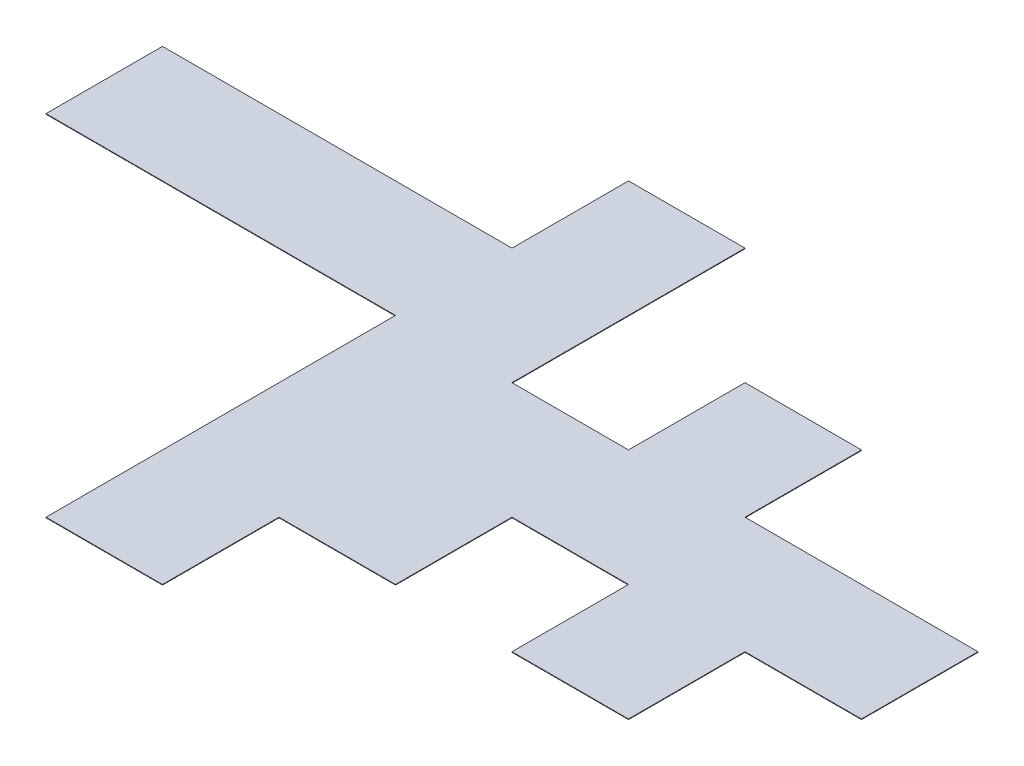
ISO-10303-21;
HEADER;
FILE_DESCRIPTION(('STEP AP214'),'2;1');
FILE_NAME('part.step','',(''),(''),'','','');
FILE_SCHEMA(('AUTOMOTIVE_DESIGN { 1 0 10303 214 1 1 1 1 }'));
ENDSEC;
DATA;
#1=APPLICATION_CONTEXT('core data for automotive mechanical design processes');
#2=APPLICATION_PROTOCOL_DEFINITION('international standard','automotive_design',2000,#1);
#3=PRODUCT_CONTEXT('',#1,'mechanical');
#4=PRODUCT('Part','Part','',(#3));
#5=PRODUCT_RELATED_PRODUCT_CATEGORY('part','',(#4));
#6=PRODUCT_DEFINITION_FORMATION('','',#4);
#7=PRODUCT_DEFINITION_CONTEXT('part definition',#1,'design');
#8=PRODUCT_DEFINITION('design','',#6,#7);
#9=PRODUCT_DEFINITION_SHAPE('','',#8);
#10=(LENGTH_UNIT() NAMED_UNIT(*) SI_UNIT(.MILLI.,.METRE.));
#11=(NAMED_UNIT(*) PLANE_ANGLE_UNIT() SI_UNIT($,.RADIAN.));
#12=(NAMED_UNIT(*) SI_UNIT($,.STERADIAN.) SOLID_ANGLE_UNIT());
#13=UNCERTAINTY_MEASURE_WITH_UNIT(LENGTH_MEASURE(1.E-05),#10,'distance_accuracy_value','');
#14=(GEOMETRIC_REPRESENTATION_CONTEXT(3) GLOBAL_UNCERTAINTY_ASSIGNED_CONTEXT((#13)) GLOBAL_UNIT_ASSIGNED_CONTEXT((#10,
#11,#12)) REPRESENTATION_CONTEXT('',''));
#15=CARTESIAN_POINT('',(0.,0.,0.));
#16=DIRECTION('',(0.,0.,1.));
#17=DIRECTION('',(1.,0.,0.));
#18=AXIS2_PLACEMENT_3D('',#15,#16,#17);
#19=CARTESIAN_POINT('',(5.37318429210575,2.601,3.02932140298636E-13));
#20=DIRECTION('',(1.,0.,0.));
#21=DIRECTION('',(0.,0.,-1.));
#22=AXIS2_PLACEMENT_3D('',#19,#20,#21);
#23=PLANE('',#22);
#24=DIRECTION('',(0.,0.,1.));
#25=VECTOR('',#24,1.);
#26=CARTESIAN_POINT('',(5.37318429210575,2.6,3.02932140298636E-13));
#27=LINE('',#26,#25);
#28=CARTESIAN_POINT('',(5.37318429210567,2.6,1.11907068929163));
#29=VERTEX_POINT('',#28);
#30=CARTESIAN_POINT('',(5.37318429210567,2.6,1.31907068929163));
#31=VERTEX_POINT('',#30);
#32=EDGE_CURVE('E11',#29,#31,#27,.T.);
#33=ORIENTED_EDGE('',*,*,#32,.F.);
#34=DIRECTION('',(0.,-1.,0.));
#35=VECTOR('',#34,1.);
#36=CARTESIAN_POINT('',(5.37318429210567,2.601,1.11907068929163));
#37=LINE('',#36,#35);
#38=CARTESIAN_POINT('',(5.37318429210567,2.601,1.11907068929163));
#39=VERTEX_POINT('',#38);
#40=EDGE_CURVE('E24',#39,#29,#37,.T.);
#41=ORIENTED_EDGE('',*,*,#40,.F.);
#42=DIRECTION('',(0.,0.,1.));
#43=VECTOR('',#42,1.);
#44=CARTESIAN_POINT('',(5.37318429210575,2.601,3.02932140298636E-13));
#45=LINE('',#44,#43);
#46=CARTESIAN_POINT('',(5.37318429210567,2.601,1.31907068929163));
#47=VERTEX_POINT('',#46);
#48=EDGE_CURVE('E348',#39,#47,#45,.T.);
#49=ORIENTED_EDGE('',*,*,#48,.T.);
#50=DIRECTION('',(0.,-1.,0.));
#51=VECTOR('',#50,1.);
#52=CARTESIAN_POINT('',(5.37318429210567,2.601,1.31907068929163));
#53=LINE('',#52,#51);
#54=EDGE_CURVE('E186',#47,#31,#53,.T.);
#55=ORIENTED_EDGE('',*,*,#54,.T.);
#56=EDGE_LOOP('',(#33,#41,#49,#55));
#57=FACE_BOUND('',#56,.T.);
#58=ADVANCED_FACE('F17',(#57),#23,.T.);
#59=CARTESIAN_POINT('',(0.,2.601,1.11907068929163));
#60=DIRECTION('',(0.,0.,-1.));
#61=DIRECTION('',(-1.,0.,0.));
#62=AXIS2_PLACEMENT_3D('',#59,#60,#61);
#63=PLANE('',#62);
#64=DIRECTION('',(1.,0.,0.));
#65=VECTOR('',#64,1.);
#66=CARTESIAN_POINT('',(0.,2.6,1.11907068929163));
#67=LINE('',#66,#65);
#68=CARTESIAN_POINT('',(5.17318429210602,2.6,1.11907068929163));
#69=VERTEX_POINT('',#68);
#70=EDGE_CURVE('E345',#69,#29,#67,.T.);
#71=ORIENTED_EDGE('',*,*,#70,.F.);
#72=DIRECTION('',(0.,-1.,0.));
#73=VECTOR('',#72,1.);
#74=CARTESIAN_POINT('',(5.17318429210602,2.601,1.11907068929163));
#75=LINE('',#74,#73);
#76=CARTESIAN_POINT('',(5.17318429210602,2.601,1.11907068929163));
#77=VERTEX_POINT('',#76);
#78=EDGE_CURVE('E342',#77,#69,#75,.T.);
#79=ORIENTED_EDGE('',*,*,#78,.F.);
#80=DIRECTION('',(1.,0.,0.));
#81=VECTOR('',#80,1.);
#82=CARTESIAN_POINT('',(0.,2.601,1.11907068929163));
#83=LINE('',#82,#81);
#84=EDGE_CURVE('E339',#77,#39,#83,.T.);
#85=ORIENTED_EDGE('',*,*,#84,.T.);
#86=ORIENTED_EDGE('',*,*,#40,.T.);
#87=EDGE_LOOP('',(#71,#79,#85,#86));
#88=FACE_BOUND('',#87,.T.);
#89=ADVANCED_FACE('F350',(#88),#63,.T.);
#90=CARTESIAN_POINT('',(5.17318429210609,2.601,2.91656437704806E-13));
#91=DIRECTION('',(1.,0.,0.));
#92=DIRECTION('',(0.,0.,-1.));
#93=AXIS2_PLACEMENT_3D('',#90,#91,#92);
#94=PLANE('',#93);
#95=DIRECTION('',(0.,0.,1.));
#96=VECTOR('',#95,1.);
#97=CARTESIAN_POINT('',(5.17318429210609,2.6,2.91656437704806E-13));
#98=LINE('',#97,#96);
#99=CARTESIAN_POINT('',(5.17318429210601,2.6,1.31907068929163));
#100=VERTEX_POINT('',#99);
#101=EDGE_CURVE('E337',#69,#100,#98,.T.);
#102=ORIENTED_EDGE('',*,*,#101,.T.);
#103=DIRECTION('',(0.,-1.,0.));
#104=VECTOR('',#103,1.);
#105=CARTESIAN_POINT('',(5.17318429210601,2.601,1.31907068929163));
#106=LINE('',#105,#104);
#107=CARTESIAN_POINT('',(5.17318429210601,2.601,1.31907068929163));
#108=VERTEX_POINT('',#107);
#109=EDGE_CURVE('E334',#108,#100,#106,.T.);
#110=ORIENTED_EDGE('',*,*,#109,.F.);
#111=DIRECTION('',(0.,0.,1.));
#112=VECTOR('',#111,1.);
#113=CARTESIAN_POINT('',(5.17318429210609,2.601,2.91656437704806E-13));
#114=LINE('',#113,#112);
#115=EDGE_CURVE('E331',#77,#108,#114,.T.);
#116=ORIENTED_EDGE('',*,*,#115,.F.);
#117=ORIENTED_EDGE('',*,*,#78,.T.);
#118=EDGE_LOOP('',(#102,#110,#116,#117));
#119=FACE_BOUND('',#118,.T.);
#120=ADVANCED_FACE('F355',(#119),#94,.F.);
#121=CARTESIAN_POINT('',(0.,2.601,1.31907068929163));
#122=DIRECTION('',(0.,0.,-1.));
#123=DIRECTION('',(-1.,0.,0.));
#124=AXIS2_PLACEMENT_3D('',#121,#122,#123);
#125=PLANE('',#124);
#126=DIRECTION('',(1.,0.,0.));
#127=VECTOR('',#126,1.);
#128=CARTESIAN_POINT('',(0.,2.6,1.31907068929163));
#129=LINE('',#128,#127);
#130=CARTESIAN_POINT('',(4.97318429210635,2.6,1.31907068929163));
#131=VERTEX_POINT('',#130);
#132=EDGE_CURVE('E328',#131,#100,#129,.T.);
#133=ORIENTED_EDGE('',*,*,#132,.F.);
#134=DIRECTION('',(0.,-1.,0.));
#135=VECTOR('',#134,1.);
#136=CARTESIAN_POINT('',(4.97318429210635,2.601,1.31907068929163));
#137=LINE('',#136,#135);
#138=CARTESIAN_POINT('',(4.97318429210635,2.601,1.31907068929163));
#139=VERTEX_POINT('',#138);
#140=EDGE_CURVE('E325',#139,#131,#137,.T.);
#141=ORIENTED_EDGE('',*,*,#140,.F.);
#142=DIRECTION('',(1.,0.,0.));
#143=VECTOR('',#142,1.);
#144=CARTESIAN_POINT('',(0.,2.601,1.31907068929163));
#145=LINE('',#144,#143);
#146=EDGE_CURVE('E322',#139,#108,#145,.T.);
#147=ORIENTED_EDGE('',*,*,#146,.T.);
#148=ORIENTED_EDGE('',*,*,#109,.T.);
#149=EDGE_LOOP('',(#133,#141,#147,#148));
#150=FACE_BOUND('',#149,.T.);
#151=ADVANCED_FACE('F358',(#150),#125,.T.);
#152=CARTESIAN_POINT('',(4.97318429210643,2.601,3.01948483965667E-13));
#153=DIRECTION('',(1.,0.,0.));
#154=DIRECTION('',(0.,0.,-1.));
#155=AXIS2_PLACEMENT_3D('',#152,#153,#154);
#156=PLANE('',#155);
#157=DIRECTION('',(0.,0.,1.));
#158=VECTOR('',#157,1.);
#159=CARTESIAN_POINT('',(4.97318429210643,2.6,3.01948483965666E-13));
#160=LINE('',#159,#158);
#161=CARTESIAN_POINT('',(4.97318429210637,2.6,0.919070689291635));
#162=VERTEX_POINT('',#161);
#163=EDGE_CURVE('E319',#162,#131,#160,.T.);
#164=ORIENTED_EDGE('',*,*,#163,.F.);
#165=DIRECTION('',(0.,-1.,0.));
#166=VECTOR('',#165,1.);
#167=CARTESIAN_POINT('',(4.97318429210637,2.601,0.919070689291635));
#168=LINE('',#167,#166);
#169=CARTESIAN_POINT('',(4.97318429210637,2.601,0.919070689291635));
#170=VERTEX_POINT('',#169);
#171=EDGE_CURVE('E316',#170,#162,#168,.T.);
#172=ORIENTED_EDGE('',*,*,#171,.F.);
#173=DIRECTION('',(0.,0.,1.));
#174=VECTOR('',#173,1.);
#175=CARTESIAN_POINT('',(4.97318429210643,2.601,3.01948483965666E-13));
#176=LINE('',#175,#174);
#177=EDGE_CURVE('E313',#170,#139,#176,.T.);
#178=ORIENTED_EDGE('',*,*,#177,.T.);
#179=ORIENTED_EDGE('',*,*,#140,.T.);
#180=EDGE_LOOP('',(#164,#172,#178,#179));
#181=FACE_BOUND('',#180,.T.);
#182=ADVANCED_FACE('F363',(#181),#156,.T.);
#183=CARTESIAN_POINT('',(0.,2.601,0.919070689291637));
#184=DIRECTION('',(0.,0.,-1.));
#185=DIRECTION('',(-1.,0.,0.));
#186=AXIS2_PLACEMENT_3D('',#183,#184,#185);
#187=PLANE('',#186);
#188=DIRECTION('',(1.,0.,0.));
#189=VECTOR('',#188,1.);
#190=CARTESIAN_POINT('',(0.,2.6,0.919070689291637));
#191=LINE('',#190,#189);
#192=CARTESIAN_POINT('',(4.77318429210671,2.6,0.919070689291635));
#193=VERTEX_POINT('',#192);
#194=EDGE_CURVE('E310',#193,#162,#191,.T.);
#195=ORIENTED_EDGE('',*,*,#194,.F.);
#196=DIRECTION('',(0.,-1.,0.));
#197=VECTOR('',#196,1.);
#198=CARTESIAN_POINT('',(4.77318429210671,2.601,0.919070689291635));
#199=LINE('',#198,#197);
#200=CARTESIAN_POINT('',(4.77318429210671,2.601,0.919070689291635));
#201=VERTEX_POINT('',#200);
#202=EDGE_CURVE('E307',#201,#193,#199,.T.);
#203=ORIENTED_EDGE('',*,*,#202,.F.);
#204=DIRECTION('',(1.,0.,0.));
#205=VECTOR('',#204,1.);
#206=CARTESIAN_POINT('',(0.,2.601,0.919070689291637));
#207=LINE('',#206,#205);
#208=EDGE_CURVE('E304',#201,#170,#207,.T.);
#209=ORIENTED_EDGE('',*,*,#208,.T.);
#210=ORIENTED_EDGE('',*,*,#171,.T.);
#211=EDGE_LOOP('',(#195,#203,#209,#210));
#212=FACE_BOUND('',#211,.T.);
#213=ADVANCED_FACE('F365',(#212),#187,.T.);
#214=CARTESIAN_POINT('',(4.77318429210676,2.601,2.69105032517145E-13));
#215=DIRECTION('',(1.,0.,0.));
#216=DIRECTION('',(0.,0.,-1.));
#217=AXIS2_PLACEMENT_3D('',#214,#215,#216);
#218=PLANE('',#217);
#219=DIRECTION('',(0.,0.,1.));
#220=VECTOR('',#219,1.);
#221=CARTESIAN_POINT('',(4.77318429210676,2.6,2.69105032517145E-13));
#222=LINE('',#221,#220);
#223=CARTESIAN_POINT('',(4.7731842921067,2.6,1.11907068929163));
#224=VERTEX_POINT('',#223);
#225=EDGE_CURVE('E302',#193,#224,#222,.T.);
#226=ORIENTED_EDGE('',*,*,#225,.T.);
#227=DIRECTION('',(0.,-1.,0.));
#228=VECTOR('',#227,1.);
#229=CARTESIAN_POINT('',(4.7731842921067,2.601,1.11907068929163));
#230=LINE('',#229,#228);
#231=CARTESIAN_POINT('',(4.7731842921067,2.601,1.11907068929163));
#232=VERTEX_POINT('',#231);
#233=EDGE_CURVE('E299',#232,#224,#230,.T.);
#234=ORIENTED_EDGE('',*,*,#233,.F.);
#235=DIRECTION('',(0.,0.,1.));
#236=VECTOR('',#235,1.);
#237=CARTESIAN_POINT('',(4.77318429210676,2.601,2.69105032517145E-13));
#238=LINE('',#237,#236);
#239=EDGE_CURVE('E296',#201,#232,#238,.T.);
#240=ORIENTED_EDGE('',*,*,#239,.F.);
#241=ORIENTED_EDGE('',*,*,#202,.T.);
#242=EDGE_LOOP('',(#226,#234,#240,#241));
#243=FACE_BOUND('',#242,.T.);
#244=ADVANCED_FACE('F369',(#243),#218,.F.);
#245=CARTESIAN_POINT('',(0.,2.601,1.11907068929163));
#246=DIRECTION('',(0.,0.,-1.));
#247=DIRECTION('',(-1.,0.,0.));
#248=AXIS2_PLACEMENT_3D('',#245,#246,#247);
#249=PLANE('',#248);
#250=DIRECTION('',(1.,0.,0.));
#251=VECTOR('',#250,1.);
#252=CARTESIAN_POINT('',(0.,2.6,1.11907068929163));
#253=LINE('',#252,#251);
#254=CARTESIAN_POINT('',(4.17318429210773,2.6,1.11907068929163));
#255=VERTEX_POINT('',#254);
#256=EDGE_CURVE('E293',#255,#224,#253,.T.);
#257=ORIENTED_EDGE('',*,*,#256,.F.);
#258=DIRECTION('',(0.,-1.,0.));
#259=VECTOR('',#258,1.);
#260=CARTESIAN_POINT('',(4.17318429210773,2.601,1.11907068929163));
#261=LINE('',#260,#259);
#262=CARTESIAN_POINT('',(4.17318429210773,2.601,1.11907068929163));
#263=VERTEX_POINT('',#262);
#264=EDGE_CURVE('E290',#263,#255,#261,.T.);
#265=ORIENTED_EDGE('',*,*,#264,.F.);
#266=DIRECTION('',(1.,0.,0.));
#267=VECTOR('',#266,1.);
#268=CARTESIAN_POINT('',(0.,2.601,1.11907068929163));
#269=LINE('',#268,#267);
#270=EDGE_CURVE('E287',#263,#232,#269,.T.);
#271=ORIENTED_EDGE('',*,*,#270,.T.);
#272=ORIENTED_EDGE('',*,*,#233,.T.);
#273=EDGE_LOOP('',(#257,#265,#271,#272));
#274=FACE_BOUND('',#273,.T.);
#275=ADVANCED_FACE('F372',(#274),#249,.T.);
#276=CARTESIAN_POINT('',(4.17318429210773,2.601,0.));
#277=DIRECTION('',(1.,0.,0.));
#278=DIRECTION('',(0.,0.,-1.));
#279=AXIS2_PLACEMENT_3D('',#276,#277,#278);
#280=PLANE('',#279);
#281=DIRECTION('',(0.,0.,1.));
#282=VECTOR('',#281,1.);
#283=CARTESIAN_POINT('',(4.17318429210773,2.6,0.));
#284=LINE('',#283,#282);
#285=CARTESIAN_POINT('',(4.17318429210773,2.6,1.31907068929163));
#286=VERTEX_POINT('',#285);
#287=EDGE_CURVE('E285',#255,#286,#284,.T.);
#288=ORIENTED_EDGE('',*,*,#287,.T.);
#289=DIRECTION('',(0.,-1.,0.));
#290=VECTOR('',#289,1.);
#291=CARTESIAN_POINT('',(4.17318429210773,2.601,1.31907068929163));
#292=LINE('',#291,#290);
#293=CARTESIAN_POINT('',(4.17318429210773,2.601,1.31907068929163));
#294=VERTEX_POINT('',#293);
#295=EDGE_CURVE('E282',#294,#286,#292,.T.);
#296=ORIENTED_EDGE('',*,*,#295,.F.);
#297=DIRECTION('',(0.,0.,1.));
#298=VECTOR('',#297,1.);
#299=CARTESIAN_POINT('',(4.17318429210773,2.601,0.));
#300=LINE('',#299,#298);
#301=EDGE_CURVE('E279',#263,#294,#300,.T.);
#302=ORIENTED_EDGE('',*,*,#301,.F.);
#303=ORIENTED_EDGE('',*,*,#264,.T.);
#304=EDGE_LOOP('',(#288,#296,#302,#303));
#305=FACE_BOUND('',#304,.T.);
#306=ADVANCED_FACE('F377',(#305),#280,.F.);
#307=CARTESIAN_POINT('',(0.,2.601,1.31907068929163));
#308=DIRECTION('',(0.,0.,-1.));
#309=DIRECTION('',(-1.,0.,0.));
#310=AXIS2_PLACEMENT_3D('',#307,#308,#309);
#311=PLANE('',#310);
#312=DIRECTION('',(1.,0.,0.));
#313=VECTOR('',#312,1.);
#314=CARTESIAN_POINT('',(0.,2.6,1.31907068929163));
#315=LINE('',#314,#313);
#316=CARTESIAN_POINT('',(4.7731842921067,2.6,1.31907068929163));
#317=VERTEX_POINT('',#316);
#318=EDGE_CURVE('E277',#286,#317,#315,.T.);
#319=ORIENTED_EDGE('',*,*,#318,.T.);
#320=DIRECTION('',(0.,-1.,0.));
#321=VECTOR('',#320,1.);
#322=CARTESIAN_POINT('',(4.7731842921067,2.601,1.31907068929163));
#323=LINE('',#322,#321);
#324=CARTESIAN_POINT('',(4.7731842921067,2.601,1.31907068929163));
#325=VERTEX_POINT('',#324);
#326=EDGE_CURVE('E274',#325,#317,#323,.T.);
#327=ORIENTED_EDGE('',*,*,#326,.F.);
#328=DIRECTION('',(1.,0.,0.));
#329=VECTOR('',#328,1.);
#330=CARTESIAN_POINT('',(0.,2.601,1.31907068929163));
#331=LINE('',#330,#329);
#332=EDGE_CURVE('E271',#294,#325,#331,.T.);
#333=ORIENTED_EDGE('',*,*,#332,.F.);
#334=ORIENTED_EDGE('',*,*,#295,.T.);
#335=EDGE_LOOP('',(#319,#327,#333,#334));
#336=FACE_BOUND('',#335,.T.);
#337=ADVANCED_FACE('F380',(#336),#311,.F.);
#338=CARTESIAN_POINT('',(4.77318429210678,2.601,2.69105032517147E-13));
#339=DIRECTION('',(1.,0.,0.));
#340=DIRECTION('',(0.,0.,-1.));
#341=AXIS2_PLACEMENT_3D('',#338,#339,#340);
#342=PLANE('',#341);
#343=DIRECTION('',(0.,0.,1.));
#344=VECTOR('',#343,1.);
#345=CARTESIAN_POINT('',(4.77318429210678,2.6,2.69105032517147E-13));
#346=LINE('',#345,#344);
#347=CARTESIAN_POINT('',(4.7731842921067,2.6,1.91907068929162));
#348=VERTEX_POINT('',#347);
#349=EDGE_CURVE('E269',#317,#348,#346,.T.);
#350=ORIENTED_EDGE('',*,*,#349,.T.);
#351=DIRECTION('',(0.,-1.,0.));
#352=VECTOR('',#351,1.);
#353=CARTESIAN_POINT('',(4.7731842921067,2.601,1.91907068929162));
#354=LINE('',#353,#352);
#355=CARTESIAN_POINT('',(4.7731842921067,2.601,1.91907068929162));
#356=VERTEX_POINT('',#355);
#357=EDGE_CURVE('E266',#356,#348,#354,.T.);
#358=ORIENTED_EDGE('',*,*,#357,.F.);
#359=DIRECTION('',(0.,0.,1.));
#360=VECTOR('',#359,1.);
#361=CARTESIAN_POINT('',(4.77318429210678,2.601,2.69105032517147E-13));
#362=LINE('',#361,#360);
#363=EDGE_CURVE('E263',#325,#356,#362,.T.);
#364=ORIENTED_EDGE('',*,*,#363,.F.);
#365=ORIENTED_EDGE('',*,*,#326,.T.);
#366=EDGE_LOOP('',(#350,#358,#364,#365));
#367=FACE_BOUND('',#366,.T.);
#368=ADVANCED_FACE('F384',(#367),#342,.F.);
#369=CARTESIAN_POINT('',(0.,2.601,1.91907068929162));
#370=DIRECTION('',(0.,0.,-1.));
#371=DIRECTION('',(-1.,0.,0.));
#372=AXIS2_PLACEMENT_3D('',#369,#370,#371);
#373=PLANE('',#372);
#374=DIRECTION('',(1.,0.,0.));
#375=VECTOR('',#374,1.);
#376=CARTESIAN_POINT('',(0.,2.6,1.91907068929162));
#377=LINE('',#376,#375);
#378=CARTESIAN_POINT('',(4.97318429210635,2.6,1.91907068929162));
#379=VERTEX_POINT('',#378);
#380=EDGE_CURVE('E261',#348,#379,#377,.T.);
#381=ORIENTED_EDGE('',*,*,#380,.T.);
#382=DIRECTION('',(0.,-1.,0.));
#383=VECTOR('',#382,1.);
#384=CARTESIAN_POINT('',(4.97318429210635,2.601,1.91907068929162));
#385=LINE('',#384,#383);
#386=CARTESIAN_POINT('',(4.97318429210635,2.601,1.91907068929162));
#387=VERTEX_POINT('',#386);
#388=EDGE_CURVE('E258',#387,#379,#385,.T.);
#389=ORIENTED_EDGE('',*,*,#388,.F.);
#390=DIRECTION('',(1.,0.,0.));
#391=VECTOR('',#390,1.);
#392=CARTESIAN_POINT('',(0.,2.601,1.91907068929162));
#393=LINE('',#392,#391);
#394=EDGE_CURVE('E255',#356,#387,#393,.T.);
#395=ORIENTED_EDGE('',*,*,#394,.F.);
#396=ORIENTED_EDGE('',*,*,#357,.T.);
#397=EDGE_LOOP('',(#381,#389,#395,#396));
#398=FACE_BOUND('',#397,.T.);
#399=ADVANCED_FACE('F388',(#398),#373,.F.);
#400=CARTESIAN_POINT('',(4.97318429210647,2.601,3.01948483965669E-13));
#401=DIRECTION('',(1.,0.,0.));
#402=DIRECTION('',(0.,0.,-1.));
#403=AXIS2_PLACEMENT_3D('',#400,#401,#402);
#404=PLANE('',#403);
#405=DIRECTION('',(0.,0.,1.));
#406=VECTOR('',#405,1.);
#407=CARTESIAN_POINT('',(4.97318429210647,2.6,3.01948483965669E-13));
#408=LINE('',#407,#406);
#409=CARTESIAN_POINT('',(4.97318429210635,2.6,1.71907068929163));
#410=VERTEX_POINT('',#409);
#411=EDGE_CURVE('E252',#410,#379,#408,.T.);
#412=ORIENTED_EDGE('',*,*,#411,.F.);
#413=DIRECTION('',(0.,-1.,0.));
#414=VECTOR('',#413,1.);
#415=CARTESIAN_POINT('',(4.97318429210635,2.601,1.71907068929163));
#416=LINE('',#415,#414);
#417=CARTESIAN_POINT('',(4.97318429210635,2.601,1.71907068929163));
#418=VERTEX_POINT('',#417);
#419=EDGE_CURVE('E249',#418,#410,#416,.T.);
#420=ORIENTED_EDGE('',*,*,#419,.F.);
#421=DIRECTION('',(0.,0.,1.));
#422=VECTOR('',#421,1.);
#423=CARTESIAN_POINT('',(4.97318429210647,2.601,3.01948483965669E-13));
#424=LINE('',#423,#422);
#425=EDGE_CURVE('E246',#418,#387,#424,.T.);
#426=ORIENTED_EDGE('',*,*,#425,.T.);
#427=ORIENTED_EDGE('',*,*,#388,.T.);
#428=EDGE_LOOP('',(#412,#420,#426,#427));
#429=FACE_BOUND('',#428,.T.);
#430=ADVANCED_FACE('F392',(#429),#404,.T.);
#431=CARTESIAN_POINT('',(0.,2.601,1.71907068929163));
#432=DIRECTION('',(0.,0.,-1.));
#433=DIRECTION('',(-1.,0.,0.));
#434=AXIS2_PLACEMENT_3D('',#431,#432,#433);
#435=PLANE('',#434);
#436=DIRECTION('',(1.,0.,0.));
#437=VECTOR('',#436,1.);
#438=CARTESIAN_POINT('',(0.,2.6,1.71907068929163));
#439=LINE('',#438,#437);
#440=CARTESIAN_POINT('',(5.17318429210601,2.6,1.71907068929163));
#441=VERTEX_POINT('',#440);
#442=EDGE_CURVE('E244',#410,#441,#439,.T.);
#443=ORIENTED_EDGE('',*,*,#442,.T.);
#444=DIRECTION('',(0.,-1.,0.));
#445=VECTOR('',#444,1.);
#446=CARTESIAN_POINT('',(5.17318429210601,2.601,1.71907068929163));
#447=LINE('',#446,#445);
#448=CARTESIAN_POINT('',(5.17318429210601,2.601,1.71907068929163));
#449=VERTEX_POINT('',#448);
#450=EDGE_CURVE('E241',#449,#441,#447,.T.);
#451=ORIENTED_EDGE('',*,*,#450,.F.);
#452=DIRECTION('',(1.,0.,0.));
#453=VECTOR('',#452,1.);
#454=CARTESIAN_POINT('',(0.,2.601,1.71907068929163));
#455=LINE('',#454,#453);
#456=EDGE_CURVE('E238',#418,#449,#455,.T.);
#457=ORIENTED_EDGE('',*,*,#456,.F.);
#458=ORIENTED_EDGE('',*,*,#419,.T.);
#459=EDGE_LOOP('',(#443,#451,#457,#458));
#460=FACE_BOUND('',#459,.T.);
#461=ADVANCED_FACE('F395',(#460),#435,.F.);
#462=CARTESIAN_POINT('',(5.17318429210611,2.601,2.91656437704808E-13));
#463=DIRECTION('',(1.,0.,0.));
#464=DIRECTION('',(0.,0.,-1.));
#465=AXIS2_PLACEMENT_3D('',#462,#463,#464);
#466=PLANE('',#465);
#467=DIRECTION('',(0.,0.,1.));
#468=VECTOR('',#467,1.);
#469=CARTESIAN_POINT('',(5.17318429210611,2.6,2.91656437704807E-13));
#470=LINE('',#469,#468);
#471=CARTESIAN_POINT('',(5.17318429210601,2.6,1.51907068929163));
#472=VERTEX_POINT('',#471);
#473=EDGE_CURVE('E235',#472,#441,#470,.T.);
#474=ORIENTED_EDGE('',*,*,#473,.F.);
#475=DIRECTION('',(0.,-1.,0.));
#476=VECTOR('',#475,1.);
#477=CARTESIAN_POINT('',(5.17318429210601,2.601,1.51907068929163));
#478=LINE('',#477,#476);
#479=CARTESIAN_POINT('',(5.17318429210601,2.601,1.51907068929163));
#480=VERTEX_POINT('',#479);
#481=EDGE_CURVE('E232',#480,#472,#478,.T.);
#482=ORIENTED_EDGE('',*,*,#481,.F.);
#483=DIRECTION('',(0.,0.,1.));
#484=VECTOR('',#483,1.);
#485=CARTESIAN_POINT('',(5.17318429210611,2.601,2.91656437704807E-13));
#486=LINE('',#485,#484);
#487=EDGE_CURVE('E229',#480,#449,#486,.T.);
#488=ORIENTED_EDGE('',*,*,#487,.T.);
#489=ORIENTED_EDGE('',*,*,#450,.T.);
#490=EDGE_LOOP('',(#474,#482,#488,#489));
#491=FACE_BOUND('',#490,.T.);
#492=ADVANCED_FACE('F399',(#491),#466,.T.);
#493=CARTESIAN_POINT('',(0.,2.601,1.51907068929163));
#494=DIRECTION('',(0.,0.,-1.));
#495=DIRECTION('',(-1.,0.,0.));
#496=AXIS2_PLACEMENT_3D('',#493,#494,#495);
#497=PLANE('',#496);
#498=DIRECTION('',(1.,0.,0.));
#499=VECTOR('',#498,1.);
#500=CARTESIAN_POINT('',(0.,2.6,1.51907068929163));
#501=LINE('',#500,#499);
#502=CARTESIAN_POINT('',(5.37318429210567,2.6,1.51907068929163));
#503=VERTEX_POINT('',#502);
#504=EDGE_CURVE('E227',#472,#503,#501,.T.);
#505=ORIENTED_EDGE('',*,*,#504,.T.);
#506=DIRECTION('',(0.,-1.,0.));
#507=VECTOR('',#506,1.);
#508=CARTESIAN_POINT('',(5.37318429210567,2.601,1.51907068929163));
#509=LINE('',#508,#507);
#510=CARTESIAN_POINT('',(5.37318429210567,2.601,1.51907068929163));
#511=VERTEX_POINT('',#510);
#512=EDGE_CURVE('E224',#511,#503,#509,.T.);
#513=ORIENTED_EDGE('',*,*,#512,.F.);
#514=DIRECTION('',(1.,0.,0.));
#515=VECTOR('',#514,1.);
#516=CARTESIAN_POINT('',(0.,2.601,1.51907068929163));
#517=LINE('',#516,#515);
#518=EDGE_CURVE('E221',#480,#511,#517,.T.);
#519=ORIENTED_EDGE('',*,*,#518,.F.);
#520=ORIENTED_EDGE('',*,*,#481,.T.);
#521=EDGE_LOOP('',(#505,#513,#519,#520));
#522=FACE_BOUND('',#521,.T.);
#523=ADVANCED_FACE('F403',(#522),#497,.F.);
#524=CARTESIAN_POINT('',(5.37318429210568,2.601,0.));
#525=DIRECTION('',(1.,0.,0.));
#526=DIRECTION('',(0.,0.,-1.));
#527=AXIS2_PLACEMENT_3D('',#524,#525,#526);
#528=PLANE('',#527);
#529=DIRECTION('',(0.,0.,1.));
#530=VECTOR('',#529,1.);
#531=CARTESIAN_POINT('',(5.37318429210568,2.6,0.));
#532=LINE('',#531,#530);
#533=CARTESIAN_POINT('',(5.37318429210568,2.6,1.71907068929163));
#534=VERTEX_POINT('',#533);
#535=EDGE_CURVE('E219',#503,#534,#532,.T.);
#536=ORIENTED_EDGE('',*,*,#535,.T.);
#537=DIRECTION('',(0.,-1.,0.));
#538=VECTOR('',#537,1.);
#539=CARTESIAN_POINT('',(5.37318429210568,2.601,1.71907068929163));
#540=LINE('',#539,#538);
#541=CARTESIAN_POINT('',(5.37318429210568,2.601,1.71907068929163));
#542=VERTEX_POINT('',#541);
#543=EDGE_CURVE('E216',#542,#534,#540,.T.);
#544=ORIENTED_EDGE('',*,*,#543,.F.);
#545=DIRECTION('',(0.,0.,1.));
#546=VECTOR('',#545,1.);
#547=CARTESIAN_POINT('',(5.37318429210568,2.601,0.));
#548=LINE('',#547,#546);
#549=EDGE_CURVE('E213',#511,#542,#548,.T.);
#550=ORIENTED_EDGE('',*,*,#549,.F.);
#551=ORIENTED_EDGE('',*,*,#512,.T.);
#552=EDGE_LOOP('',(#536,#544,#550,#551));
#553=FACE_BOUND('',#552,.T.);
#554=ADVANCED_FACE('F407',(#553),#528,.F.);
#555=CARTESIAN_POINT('',(0.,2.601,1.71907068929163));
#556=DIRECTION('',(0.,0.,-1.));
#557=DIRECTION('',(-1.,0.,0.));
#558=AXIS2_PLACEMENT_3D('',#555,#556,#557);
#559=PLANE('',#558);
#560=DIRECTION('',(1.,0.,0.));
#561=VECTOR('',#560,1.);
#562=CARTESIAN_POINT('',(0.,2.6,1.71907068929163));
#563=LINE('',#562,#561);
#564=CARTESIAN_POINT('',(5.57318429210533,2.6,1.71907068929163));
#565=VERTEX_POINT('',#564);
#566=EDGE_CURVE('E211',#534,#565,#563,.T.);
#567=ORIENTED_EDGE('',*,*,#566,.T.);
#568=DIRECTION('',(0.,-1.,0.));
#569=VECTOR('',#568,1.);
#570=CARTESIAN_POINT('',(5.57318429210533,2.601,1.71907068929163));
#571=LINE('',#570,#569);
#572=CARTESIAN_POINT('',(5.57318429210533,2.601,1.71907068929163));
#573=VERTEX_POINT('',#572);
#574=EDGE_CURVE('E208',#573,#565,#571,.T.);
#575=ORIENTED_EDGE('',*,*,#574,.F.);
#576=DIRECTION('',(1.,0.,0.));
#577=VECTOR('',#576,1.);
#578=CARTESIAN_POINT('',(0.,2.601,1.71907068929163));
#579=LINE('',#578,#577);
#580=EDGE_CURVE('E205',#542,#573,#579,.T.);
#581=ORIENTED_EDGE('',*,*,#580,.F.);
#582=ORIENTED_EDGE('',*,*,#543,.T.);
#583=EDGE_LOOP('',(#567,#575,#581,#582));
#584=FACE_BOUND('',#583,.T.);
#585=ADVANCED_FACE('F410',(#584),#559,.F.);
#586=CARTESIAN_POINT('',(5.57318429210543,2.601,3.38377676961119E-13));
#587=DIRECTION('',(1.,0.,0.));
#588=DIRECTION('',(0.,0.,-1.));
#589=AXIS2_PLACEMENT_3D('',#586,#587,#588);
#590=PLANE('',#589);
#591=DIRECTION('',(0.,0.,1.));
#592=VECTOR('',#591,1.);
#593=CARTESIAN_POINT('',(5.57318429210543,2.6,3.38377676961119E-13));
#594=LINE('',#593,#592);
#595=CARTESIAN_POINT('',(5.57318429210533,2.6,1.51907068929163));
#596=VERTEX_POINT('',#595);
#597=EDGE_CURVE('E202',#596,#565,#594,.T.);
#598=ORIENTED_EDGE('',*,*,#597,.F.);
#599=DIRECTION('',(0.,-1.,0.));
#600=VECTOR('',#599,1.);
#601=CARTESIAN_POINT('',(5.57318429210533,2.601,1.51907068929163));
#602=LINE('',#601,#600);
#603=CARTESIAN_POINT('',(5.57318429210533,2.601,1.51907068929163));
#604=VERTEX_POINT('',#603);
#605=EDGE_CURVE('E199',#604,#596,#602,.T.);
#606=ORIENTED_EDGE('',*,*,#605,.F.);
#607=DIRECTION('',(0.,0.,1.));
#608=VECTOR('',#607,1.);
#609=CARTESIAN_POINT('',(5.57318429210543,2.601,3.38377676961119E-13));
#610=LINE('',#609,#608);
#611=EDGE_CURVE('E196',#604,#573,#610,.T.);
#612=ORIENTED_EDGE('',*,*,#611,.T.);
#613=ORIENTED_EDGE('',*,*,#574,.T.);
#614=EDGE_LOOP('',(#598,#606,#612,#613));
#615=FACE_BOUND('',#614,.T.);
#616=ADVANCED_FACE('F413',(#615),#590,.T.);
#617=CARTESIAN_POINT('',(0.,2.601,1.51907068929163));
#618=DIRECTION('',(0.,0.,-1.));
#619=DIRECTION('',(-1.,0.,0.));
#620=AXIS2_PLACEMENT_3D('',#617,#618,#619);
#621=PLANE('',#620);
#622=DIRECTION('',(1.,0.,0.));
#623=VECTOR('',#622,1.);
#624=CARTESIAN_POINT('',(0.,2.6,1.51907068929163));
#625=LINE('',#624,#623);
#626=CARTESIAN_POINT('',(5.77318429210499,2.6,1.51907068929163));
#627=VERTEX_POINT('',#626);
#628=EDGE_CURVE('E194',#596,#627,#625,.T.);
#629=ORIENTED_EDGE('',*,*,#628,.T.);
#630=DIRECTION('',(0.,-1.,0.));
#631=VECTOR('',#630,1.);
#632=CARTESIAN_POINT('',(5.77318429210499,2.601,1.51907068929163));
#633=LINE('',#632,#631);
#634=CARTESIAN_POINT('',(5.77318429210499,2.601,1.51907068929163));
#635=VERTEX_POINT('',#634);
#636=EDGE_CURVE('E192',#635,#627,#633,.T.);
#637=ORIENTED_EDGE('',*,*,#636,.F.);
#638=DIRECTION('',(1.,0.,0.));
#639=VECTOR('',#638,1.);
#640=CARTESIAN_POINT('',(0.,2.601,1.51907068929163));
#641=LINE('',#640,#639);
#642=EDGE_CURVE('E181',#604,#635,#641,.T.);
#643=ORIENTED_EDGE('',*,*,#642,.F.);
#644=ORIENTED_EDGE('',*,*,#605,.T.);
#645=EDGE_LOOP('',(#629,#637,#643,#644));
#646=FACE_BOUND('',#645,.T.);
#647=ADVANCED_FACE('F415',(#646),#621,.F.);
#648=CARTESIAN_POINT('',(5.77318429210507,2.601,3.25483545486297E-13));
#649=DIRECTION('',(1.,0.,0.));
#650=DIRECTION('',(0.,0.,-1.));
#651=AXIS2_PLACEMENT_3D('',#648,#649,#650);
#652=PLANE('',#651);
#653=DIRECTION('',(0.,0.,1.));
#654=VECTOR('',#653,1.);
#655=CARTESIAN_POINT('',(5.77318429210507,2.6,3.25483545486297E-13));
#656=LINE('',#655,#654);
#657=CARTESIAN_POINT('',(5.77318429210499,2.6,1.31907068929163));
#658=VERTEX_POINT('',#657);
#659=EDGE_CURVE('E168',#658,#627,#656,.T.);
#660=ORIENTED_EDGE('',*,*,#659,.F.);
#661=DIRECTION('',(0.,-1.,0.));
#662=VECTOR('',#661,1.);
#663=CARTESIAN_POINT('',(5.77318429210499,2.601,1.31907068929163));
#664=LINE('',#663,#662);
#665=CARTESIAN_POINT('',(5.77318429210499,2.601,1.31907068929163));
#666=VERTEX_POINT('',#665);
#667=EDGE_CURVE('E162',#666,#658,#664,.T.);
#668=ORIENTED_EDGE('',*,*,#667,.F.);
#669=DIRECTION('',(0.,0.,1.));
#670=VECTOR('',#669,1.);
#671=CARTESIAN_POINT('',(5.77318429210507,2.601,3.25483545486297E-13));
#672=LINE('',#671,#670);
#673=EDGE_CURVE('E166',#666,#635,#672,.T.);
#674=ORIENTED_EDGE('',*,*,#673,.T.);
#675=ORIENTED_EDGE('',*,*,#636,.T.);
#676=EDGE_LOOP('',(#660,#668,#674,#675));
#677=FACE_BOUND('',#676,.T.);
#678=ADVANCED_FACE('F164',(#677),#652,.T.);
#679=CARTESIAN_POINT('',(0.,2.601,1.31907068929163));
#680=DIRECTION('',(0.,0.,-1.));
#681=DIRECTION('',(-1.,0.,0.));
#682=AXIS2_PLACEMENT_3D('',#679,#680,#681);
#683=PLANE('',#682);
#684=DIRECTION('',(1.,0.,0.));
#685=VECTOR('',#684,1.);
#686=CARTESIAN_POINT('',(0.,2.6,1.31907068929163));
#687=LINE('',#686,#685);
#688=EDGE_CURVE('E182',#31,#658,#687,.T.);
#689=ORIENTED_EDGE('',*,*,#688,.F.);
#690=ORIENTED_EDGE('',*,*,#54,.F.);
#691=DIRECTION('',(1.,0.,0.));
#692=VECTOR('',#691,1.);
#693=CARTESIAN_POINT('',(0.,2.601,1.31907068929163));
#694=LINE('',#693,#692);
#695=EDGE_CURVE('E178',#47,#666,#694,.T.);
#696=ORIENTED_EDGE('',*,*,#695,.T.);
#697=ORIENTED_EDGE('',*,*,#667,.T.);
#698=EDGE_LOOP('',(#689,#690,#696,#697));
#699=FACE_BOUND('',#698,.T.);
#700=ADVANCED_FACE('F185',(#699),#683,.T.);
#701=CARTESIAN_POINT('',(0.,2.601,0.));
#702=DIRECTION('',(0.,1.,0.));
#703=DIRECTION('',(0.,0.,1.));
#704=AXIS2_PLACEMENT_3D('',#701,#702,#703);
#705=PLANE('',#704);
#706=ORIENTED_EDGE('',*,*,#48,.F.);
#707=ORIENTED_EDGE('',*,*,#84,.F.);
#708=ORIENTED_EDGE('',*,*,#115,.T.);
#709=ORIENTED_EDGE('',*,*,#146,.F.);
#710=ORIENTED_EDGE('',*,*,#177,.F.);
#711=ORIENTED_EDGE('',*,*,#208,.F.);
#712=ORIENTED_EDGE('',*,*,#239,.T.);
#713=ORIENTED_EDGE('',*,*,#270,.F.);
#714=ORIENTED_EDGE('',*,*,#301,.T.);
#715=ORIENTED_EDGE('',*,*,#332,.T.);
#716=ORIENTED_EDGE('',*,*,#363,.T.);
#717=ORIENTED_EDGE('',*,*,#394,.T.);
#718=ORIENTED_EDGE('',*,*,#425,.F.);
#719=ORIENTED_EDGE('',*,*,#456,.T.);
#720=ORIENTED_EDGE('',*,*,#487,.F.);
#721=ORIENTED_EDGE('',*,*,#518,.T.);
#722=ORIENTED_EDGE('',*,*,#549,.T.);
#723=ORIENTED_EDGE('',*,*,#580,.T.);
#724=ORIENTED_EDGE('',*,*,#611,.F.);
#725=ORIENTED_EDGE('',*,*,#642,.T.);
#726=ORIENTED_EDGE('',*,*,#673,.F.);
#727=ORIENTED_EDGE('',*,*,#695,.F.);
#728=EDGE_LOOP('',(#706,#707,#708,#709,#710,#711,#712,#713,#714,#715,#716,#717,#718,#719,#720,
#721,#722,#723,#724,#725,#726,#727));
#729=FACE_BOUND('',#728,.T.);
#730=ADVANCED_FACE('F177',(#729),#705,.T.);
#731=CARTESIAN_POINT('',(0.,2.6,0.));
#732=DIRECTION('',(0.,1.,0.));
#733=DIRECTION('',(0.,0.,1.));
#734=AXIS2_PLACEMENT_3D('',#731,#732,#733);
#735=PLANE('',#734);
#736=ORIENTED_EDGE('',*,*,#32,.T.);
#737=ORIENTED_EDGE('',*,*,#688,.T.);
#738=ORIENTED_EDGE('',*,*,#659,.T.);
#739=ORIENTED_EDGE('',*,*,#628,.F.);
#740=ORIENTED_EDGE('',*,*,#597,.T.);
#741=ORIENTED_EDGE('',*,*,#566,.F.);
#742=ORIENTED_EDGE('',*,*,#535,.F.);
#743=ORIENTED_EDGE('',*,*,#504,.F.);
#744=ORIENTED_EDGE('',*,*,#473,.T.);
#745=ORIENTED_EDGE('',*,*,#442,.F.);
#746=ORIENTED_EDGE('',*,*,#411,.T.);
#747=ORIENTED_EDGE('',*,*,#380,.F.);
#748=ORIENTED_EDGE('',*,*,#349,.F.);
#749=ORIENTED_EDGE('',*,*,#318,.F.);
#750=ORIENTED_EDGE('',*,*,#287,.F.);
#751=ORIENTED_EDGE('',*,*,#256,.T.);
#752=ORIENTED_EDGE('',*,*,#225,.F.);
#753=ORIENTED_EDGE('',*,*,#194,.T.);
#754=ORIENTED_EDGE('',*,*,#163,.T.);
#755=ORIENTED_EDGE('',*,*,#132,.T.);
#756=ORIENTED_EDGE('',*,*,#101,.F.);
#757=ORIENTED_EDGE('',*,*,#70,.T.);
#758=EDGE_LOOP('',(#736,#737,#738,#739,#740,#741,#742,#743,#744,#745,#746,#747,#748,#749,#750,
#751,#752,#753,#754,#755,#756,#757));
#759=FACE_BOUND('',#758,.T.);
#760=ADVANCED_FACE('F353',(#759),#735,.F.);
#761=CLOSED_SHELL('',(#58,#89,#120,#151,#182,#213,#244,#275,#306,#337,#368,#399,#430,#461,#492,
#523,#554,#585,#616,#647,#678,#700,#730,#760));
#762=MANIFOLD_SOLID_BREP('B1',#761);
#763=ADVANCED_BREP_SHAPE_REPRESENTATION('',(#18,#762),#14);
#764=SHAPE_DEFINITION_REPRESENTATION(#9,#763);
ENDSEC;
END-ISO-10303-21;
